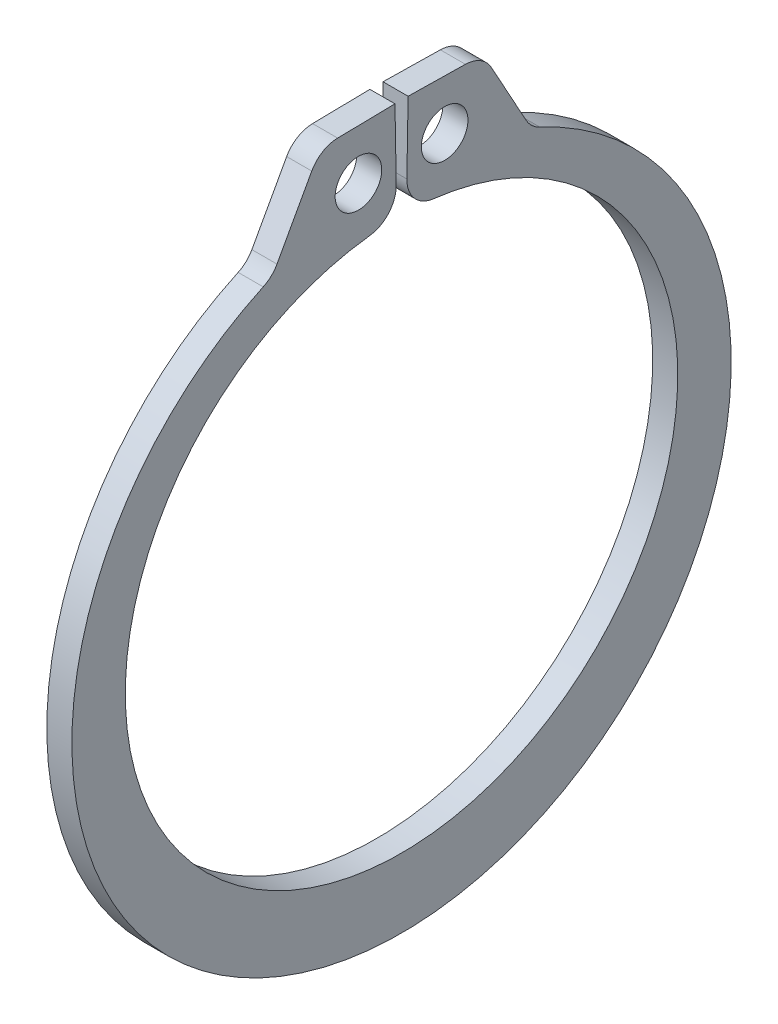
ISO-10303-21;
HEADER;
FILE_DESCRIPTION(('STEP AP214'),'2;1');
FILE_NAME('part.step','',(''),(''),'','','');
FILE_SCHEMA(('AUTOMOTIVE_DESIGN { 1 0 10303 214 1 1 1 1 }'));
ENDSEC;
DATA;
#1=APPLICATION_CONTEXT('core data for automotive mechanical design processes');
#2=APPLICATION_PROTOCOL_DEFINITION('international standard','automotive_design',2000,#1);
#3=PRODUCT_CONTEXT('',#1,'mechanical');
#4=PRODUCT('Part','Part','',(#3));
#5=PRODUCT_RELATED_PRODUCT_CATEGORY('part','',(#4));
#6=PRODUCT_DEFINITION_FORMATION('','',#4);
#7=PRODUCT_DEFINITION_CONTEXT('part definition',#1,'design');
#8=PRODUCT_DEFINITION('design','',#6,#7);
#9=PRODUCT_DEFINITION_SHAPE('','',#8);
#10=(LENGTH_UNIT() NAMED_UNIT(*) SI_UNIT(.MILLI.,.METRE.));
#11=(NAMED_UNIT(*) PLANE_ANGLE_UNIT() SI_UNIT($,.RADIAN.));
#12=(NAMED_UNIT(*) SI_UNIT($,.STERADIAN.) SOLID_ANGLE_UNIT());
#13=UNCERTAINTY_MEASURE_WITH_UNIT(LENGTH_MEASURE(1.E-05),#10,'distance_accuracy_value','');
#14=(GEOMETRIC_REPRESENTATION_CONTEXT(3) GLOBAL_UNCERTAINTY_ASSIGNED_CONTEXT((#13)) GLOBAL_UNIT_ASSIGNED_CONTEXT((#10,
#11,#12)) REPRESENTATION_CONTEXT('',''));
#15=CARTESIAN_POINT('',(0.,0.,0.));
#16=DIRECTION('',(0.,0.,1.));
#17=DIRECTION('',(1.,0.,0.));
#18=AXIS2_PLACEMENT_3D('',#15,#16,#17);
#19=CARTESIAN_POINT('',(0.5334,-0.676181068147733,0.));
#20=DIRECTION('',(1.,0.,0.));
#21=DIRECTION('',(0.,0.,-1.));
#22=AXIS2_PLACEMENT_3D('',#19,#20,#21);
#23=PLANE('',#22);
#24=CARTESIAN_POINT('',(0.5334,13.8385266688973,1.83246968592772));
#25=DIRECTION('',(1.,0.,0.));
#26=DIRECTION('',(0.,0.,-1.));
#27=AXIS2_PLACEMENT_3D('',#24,#25,#26);
#28=CIRCLE('',#27,0.9906);
#29=CARTESIAN_POINT('',(0.5334,13.8385266688973,0.841869685927717));
#30=VERTEX_POINT('',#29);
#31=EDGE_CURVE('E225',#30,#30,#28,.T.);
#32=ORIENTED_EDGE('',*,*,#31,.F.);
#33=EDGE_LOOP('',(#32));
#34=FACE_BOUND('',#33,.T.);
#35=DIRECTION('',(0.,0.876068599712976,0.482186487364531));
#36=VECTOR('',#35,1.);
#37=CARTESIAN_POINT('',(0.5334,15.9313425389448,-3.45991722723344));
#38=LINE('',#37,#36);
#39=CARTESIAN_POINT('',(0.5334,12.5932417303443,-5.29720154936887));
#40=VERTEX_POINT('',#39);
#41=CARTESIAN_POINT('',(0.5334,15.2803079489985,-3.81824542457083));
#42=VERTEX_POINT('',#41);
#43=EDGE_CURVE('E233',#40,#42,#38,.T.);
#44=ORIENTED_EDGE('',*,*,#43,.T.);
#45=CARTESIAN_POINT('',(0.5334,14.661807341656,-2.69451223171899));
#46=DIRECTION('',(1.,0.,0.));
#47=DIRECTION('',(0.,0.,-1.));
#48=AXIS2_PLACEMENT_3D('',#45,#46,#47);
#49=CIRCLE('',#48,1.2827);
#50=CARTESIAN_POINT('',(0.5334,15.9443119802331,-2.7168984334561));
#51=VERTEX_POINT('',#50);
#52=EDGE_CURVE('E291',#42,#51,#49,.T.);
#53=ORIENTED_EDGE('',*,*,#52,.T.);
#54=DIRECTION('',(0.,0.0174524064372829,0.999847695156391));
#55=VECTOR('',#54,1.);
#56=CARTESIAN_POINT('',(0.5334,15.9868647521641,-0.279051762247657));
#57=LINE('',#56,#55);
#58=CARTESIAN_POINT('',(0.5334,15.9868647521641,-0.279051762247657));
#59=VERTEX_POINT('',#58);
#60=EDGE_CURVE('E237',#51,#59,#57,.T.);
#61=ORIENTED_EDGE('',*,*,#60,.T.);
#62=DIRECTION('',(0.,-0.999847695156391,0.0174524064372838));
#63=VECTOR('',#62,1.);
#64=CARTESIAN_POINT('',(0.5334,11.7457107988497,-0.205022144621986));
#65=LINE('',#64,#63);
#66=CARTESIAN_POINT('',(0.5334,12.9649365342077,-0.226303808994815));
#67=VERTEX_POINT('',#66);
#68=EDGE_CURVE('E194',#59,#67,#65,.T.);
#69=ORIENTED_EDGE('',*,*,#68,.T.);
#70=CARTESIAN_POINT('',(0.5334,12.9425503324706,-1.50880844757192));
#71=DIRECTION('',(1.,0.,0.));
#72=DIRECTION('',(0.,0.,-1.));
#73=AXIS2_PLACEMENT_3D('',#70,#71,#72);
#74=CIRCLE('',#73,1.2827);
#75=CARTESIAN_POINT('',(0.5334,11.6684786135822,-1.36028052047176));
#76=VERTEX_POINT('',#75);
#77=EDGE_CURVE('E288',#67,#76,#74,.T.);
#78=ORIENTED_EDGE('',*,*,#77,.T.);
#79=CARTESIAN_POINT('',(0.5334,0.,0.));
#80=DIRECTION('',(-1.,0.,0.));
#81=DIRECTION('',(0.,0.,-1.));
#82=AXIS2_PLACEMENT_3D('',#79,#80,#81);
#83=CIRCLE('',#82,11.7475);
#84=CARTESIAN_POINT('',(0.5334,11.6684786135822,1.36028052047176));
#85=VERTEX_POINT('',#84);
#86=EDGE_CURVE('E242',#76,#85,#83,.T.);
#87=ORIENTED_EDGE('',*,*,#86,.T.);
#88=CARTESIAN_POINT('',(0.5334,12.9425503324706,1.50880844757192));
#89=DIRECTION('',(1.,0.,0.));
#90=DIRECTION('',(0.,0.,-1.));
#91=AXIS2_PLACEMENT_3D('',#88,#89,#90);
#92=CIRCLE('',#91,1.2827);
#93=CARTESIAN_POINT('',(0.5334,12.9649365342077,0.226303808994816));
#94=VERTEX_POINT('',#93);
#95=EDGE_CURVE('E285',#85,#94,#92,.T.);
#96=ORIENTED_EDGE('',*,*,#95,.T.);
#97=DIRECTION('',(0.,0.999847695156391,0.0174524064372836));
#98=VECTOR('',#97,1.);
#99=CARTESIAN_POINT('',(0.5334,11.7457107988497,0.205022144621988));
#100=LINE('',#99,#98);
#101=CARTESIAN_POINT('',(0.5334,15.9868647521641,0.279051762247657));
#102=VERTEX_POINT('',#101);
#103=EDGE_CURVE('E246',#94,#102,#100,.T.);
#104=ORIENTED_EDGE('',*,*,#103,.T.);
#105=DIRECTION('',(0.,-0.0174524064372829,0.999847695156391));
#106=VECTOR('',#105,1.);
#107=CARTESIAN_POINT('',(0.5334,15.9868647521641,0.279051762247657));
#108=LINE('',#107,#106);
#109=CARTESIAN_POINT('',(0.5334,15.9443119802331,2.71689843345609));
#110=VERTEX_POINT('',#109);
#111=EDGE_CURVE('E249',#102,#110,#108,.T.);
#112=ORIENTED_EDGE('',*,*,#111,.T.);
#113=CARTESIAN_POINT('',(0.5334,14.661807341656,2.69451223171899));
#114=DIRECTION('',(1.,0.,0.));
#115=DIRECTION('',(0.,0.,-1.));
#116=AXIS2_PLACEMENT_3D('',#113,#114,#115);
#117=CIRCLE('',#116,1.2827);
#118=CARTESIAN_POINT('',(0.5334,15.2803079489985,3.81824542457083));
#119=VERTEX_POINT('',#118);
#120=EDGE_CURVE('E72',#110,#119,#117,.T.);
#121=ORIENTED_EDGE('',*,*,#120,.T.);
#122=DIRECTION('',(0.,-0.876068599712977,0.48218648736453));
#123=VECTOR('',#122,1.);
#124=CARTESIAN_POINT('',(0.5334,15.9313425389448,3.45991722723344));
#125=LINE('',#124,#123);
#126=CARTESIAN_POINT('',(0.5334,12.5932417303443,5.29720154936887));
#127=VERTEX_POINT('',#126);
#128=EDGE_CURVE('E252',#119,#127,#125,.T.);
#129=ORIENTED_EDGE('',*,*,#128,.T.);
#130=CARTESIAN_POINT('',(0.5334,13.2117423376868,6.4209347422207));
#131=DIRECTION('',(1.,0.,0.));
#132=DIRECTION('',(0.,0.,-1.));
#133=AXIS2_PLACEMENT_3D('',#130,#131,#132);
#134=CIRCLE('',#133,1.2827);
#135=CARTESIAN_POINT('',(0.5334,12.0474579195929,5.88264013535209));
#136=VERTEX_POINT('',#135);
#137=EDGE_CURVE('E11',#127,#136,#134,.F.);
#138=ORIENTED_EDGE('',*,*,#137,.T.);
#139=CARTESIAN_POINT('',(0.5334,-0.676181068147733,0.));
#140=DIRECTION('',(1.,0.,0.));
#141=DIRECTION('',(0.,0.,-1.));
#142=AXIS2_PLACEMENT_3D('',#139,#140,#141);
#143=CIRCLE('',#142,14.0177189318523);
#144=CARTESIAN_POINT('',(0.5334,12.0474579195929,-5.88264013535209));
#145=VERTEX_POINT('',#144);
#146=EDGE_CURVE('E229',#136,#145,#143,.T.);
#147=ORIENTED_EDGE('',*,*,#146,.T.);
#148=CARTESIAN_POINT('',(0.5334,13.2117423376868,-6.42093474222071));
#149=DIRECTION('',(1.,0.,0.));
#150=DIRECTION('',(0.,0.,-1.));
#151=AXIS2_PLACEMENT_3D('',#148,#149,#150);
#152=CIRCLE('',#151,1.2827);
#153=EDGE_CURVE('E320',#145,#40,#152,.F.);
#154=ORIENTED_EDGE('',*,*,#153,.T.);
#155=EDGE_LOOP('',(#44,#53,#61,#69,#78,#87,#96,#104,#112,#121,#129,#138,#147,#154));
#156=FACE_BOUND('',#155,.T.);
#157=CARTESIAN_POINT('',(0.5334,13.8385266688973,-1.83246968592772));
#158=DIRECTION('',(1.,0.,0.));
#159=DIRECTION('',(0.,0.,-1.));
#160=AXIS2_PLACEMENT_3D('',#157,#158,#159);
#161=CIRCLE('',#160,0.990600000000001);
#162=CARTESIAN_POINT('',(0.5334,13.8385266688973,-2.82306968592772));
#163=VERTEX_POINT('',#162);
#164=EDGE_CURVE('E221',#163,#163,#161,.T.);
#165=ORIENTED_EDGE('',*,*,#164,.F.);
#166=EDGE_LOOP('',(#165));
#167=FACE_BOUND('',#166,.T.);
#168=ADVANCED_FACE('F43',(#34,#156,#167),#23,.T.);
#169=CARTESIAN_POINT('',(0.5334,-0.676181068147733,0.));
#170=DIRECTION('',(-1.,0.,0.));
#171=DIRECTION('',(0.,0.,1.));
#172=AXIS2_PLACEMENT_3D('',#169,#170,#171);
#173=CYLINDRICAL_SURFACE('',#172,14.0177189318523);
#174=CARTESIAN_POINT('',(-0.5334,-0.676181068147733,0.));
#175=DIRECTION('',(1.,0.,0.));
#176=DIRECTION('',(0.,0.,-1.));
#177=AXIS2_PLACEMENT_3D('',#174,#175,#176);
#178=CIRCLE('',#177,14.0177189318523);
#179=CARTESIAN_POINT('',(-0.5334,12.0474579195929,5.88264013535209));
#180=VERTEX_POINT('',#179);
#181=CARTESIAN_POINT('',(-0.5334,12.0474579195929,-5.88264013535209));
#182=VERTEX_POINT('',#181);
#183=EDGE_CURVE('E326',#180,#182,#178,.T.);
#184=ORIENTED_EDGE('',*,*,#183,.T.);
#185=DIRECTION('',(-1.,0.,0.));
#186=VECTOR('',#185,1.);
#187=CARTESIAN_POINT('',(0.5334,12.0474579195929,-5.88264013535209));
#188=LINE('',#187,#186);
#189=EDGE_CURVE('E268',#182,#145,#188,.F.);
#190=ORIENTED_EDGE('',*,*,#189,.T.);
#191=ORIENTED_EDGE('',*,*,#146,.F.);
#192=DIRECTION('',(-1.,0.,0.));
#193=VECTOR('',#192,1.);
#194=CARTESIAN_POINT('',(0.5334,12.0474579195929,5.88264013535209));
#195=LINE('',#194,#193);
#196=EDGE_CURVE('E264',#136,#180,#195,.T.);
#197=ORIENTED_EDGE('',*,*,#196,.T.);
#198=EDGE_LOOP('',(#184,#190,#191,#197));
#199=FACE_BOUND('',#198,.T.);
#200=ADVANCED_FACE('F336',(#199),#173,.T.);
#201=CARTESIAN_POINT('',(0.5334,15.9313425389448,-3.45991722723344));
#202=DIRECTION('',(0.,-0.482186487364531,0.876068599712976));
#203=DIRECTION('',(0.,-0.876068599712976,-0.482186487364531));
#204=AXIS2_PLACEMENT_3D('',#201,#202,#203);
#205=PLANE('',#204);
#206=ORIENTED_EDGE('',*,*,#43,.F.);
#207=DIRECTION('',(1.,0.,0.));
#208=VECTOR('',#207,1.);
#209=CARTESIAN_POINT('',(-0.5334,12.5932417303443,-5.29720154936887));
#210=LINE('',#209,#208);
#211=CARTESIAN_POINT('',(-0.5334,12.5932417303443,-5.29720154936887));
#212=VERTEX_POINT('',#211);
#213=EDGE_CURVE('E260',#40,#212,#210,.F.);
#214=ORIENTED_EDGE('',*,*,#213,.T.);
#215=DIRECTION('',(0.,0.876068599712976,0.482186487364531));
#216=VECTOR('',#215,1.);
#217=CARTESIAN_POINT('',(-0.5334,15.9313425389448,-3.45991722723344));
#218=LINE('',#217,#216);
#219=CARTESIAN_POINT('',(-0.5334,15.2803079489985,-3.81824542457083));
#220=VERTEX_POINT('',#219);
#221=EDGE_CURVE('E187',#212,#220,#218,.T.);
#222=ORIENTED_EDGE('',*,*,#221,.T.);
#223=DIRECTION('',(-1.,0.,0.));
#224=VECTOR('',#223,1.);
#225=CARTESIAN_POINT('',(0.5334,15.2803079489985,-3.81824542457083));
#226=LINE('',#225,#224);
#227=EDGE_CURVE('E196',#220,#42,#226,.F.);
#228=ORIENTED_EDGE('',*,*,#227,.T.);
#229=EDGE_LOOP('',(#206,#214,#222,#228));
#230=FACE_BOUND('',#229,.T.);
#231=ADVANCED_FACE('F344',(#230),#205,.F.);
#232=CARTESIAN_POINT('',(0.5334,15.9868647521641,-0.279051762247657));
#233=DIRECTION('',(0.,-0.999847695156391,0.0174524064372829));
#234=DIRECTION('',(0.,-0.0174524064372829,-0.999847695156391));
#235=AXIS2_PLACEMENT_3D('',#232,#233,#234);
#236=PLANE('',#235);
#237=ORIENTED_EDGE('',*,*,#60,.F.);
#238=DIRECTION('',(-1.,0.,0.));
#239=VECTOR('',#238,1.);
#240=CARTESIAN_POINT('',(0.5334,15.9443119802331,-2.7168984334561));
#241=LINE('',#240,#239);
#242=CARTESIAN_POINT('',(-0.5334,15.9443119802331,-2.7168984334561));
#243=VERTEX_POINT('',#242);
#244=EDGE_CURVE('E182',#51,#243,#241,.T.);
#245=ORIENTED_EDGE('',*,*,#244,.T.);
#246=DIRECTION('',(0.,0.0174524064372829,0.999847695156391));
#247=VECTOR('',#246,1.);
#248=CARTESIAN_POINT('',(-0.5334,15.9868647521641,-0.279051762247657));
#249=LINE('',#248,#247);
#250=CARTESIAN_POINT('',(-0.5334,15.9868647521641,-0.279051762247657));
#251=VERTEX_POINT('',#250);
#252=EDGE_CURVE('E175',#243,#251,#249,.T.);
#253=ORIENTED_EDGE('',*,*,#252,.T.);
#254=DIRECTION('',(-1.,0.,0.));
#255=VECTOR('',#254,1.);
#256=CARTESIAN_POINT('',(0.5334,15.9868647521641,-0.279051762247657));
#257=LINE('',#256,#255);
#258=EDGE_CURVE('E179',#59,#251,#257,.T.);
#259=ORIENTED_EDGE('',*,*,#258,.F.);
#260=EDGE_LOOP('',(#237,#245,#253,#259));
#261=FACE_BOUND('',#260,.T.);
#262=ADVANCED_FACE('F178',(#261),#236,.F.);
#263=CARTESIAN_POINT('',(0.5334,11.7457107988497,-0.205022144621986));
#264=DIRECTION('',(0.,-0.0174524064372838,-0.999847695156391));
#265=DIRECTION('',(0.,0.999847695156391,-0.0174524064372838));
#266=AXIS2_PLACEMENT_3D('',#263,#264,#265);
#267=PLANE('',#266);
#268=DIRECTION('',(0.,-0.999847695156391,0.0174524064372838));
#269=VECTOR('',#268,1.);
#270=CARTESIAN_POINT('',(-0.5334,11.7457107988497,-0.205022144621986));
#271=LINE('',#270,#269);
#272=CARTESIAN_POINT('',(-0.5334,12.9649365342077,-0.226303808994815));
#273=VERTEX_POINT('',#272);
#274=EDGE_CURVE('E186',#251,#273,#271,.T.);
#275=ORIENTED_EDGE('',*,*,#274,.T.);
#276=DIRECTION('',(-1.,0.,0.));
#277=VECTOR('',#276,1.);
#278=CARTESIAN_POINT('',(0.5334,12.9649365342077,-0.226303808994815));
#279=LINE('',#278,#277);
#280=EDGE_CURVE('E301',#273,#67,#279,.F.);
#281=ORIENTED_EDGE('',*,*,#280,.T.);
#282=ORIENTED_EDGE('',*,*,#68,.F.);
#283=ORIENTED_EDGE('',*,*,#258,.T.);
#284=EDGE_LOOP('',(#275,#281,#282,#283));
#285=FACE_BOUND('',#284,.T.);
#286=ADVANCED_FACE('F191',(#285),#267,.F.);
#287=CARTESIAN_POINT('',(0.5334,0.,0.));
#288=DIRECTION('',(-1.,0.,0.));
#289=DIRECTION('',(0.,0.,1.));
#290=AXIS2_PLACEMENT_3D('',#287,#288,#289);
#291=CYLINDRICAL_SURFACE('',#290,11.7475);
#292=ORIENTED_EDGE('',*,*,#86,.F.);
#293=DIRECTION('',(-1.,0.,0.));
#294=VECTOR('',#293,1.);
#295=CARTESIAN_POINT('',(0.5334,11.6684786135822,-1.36028052047176));
#296=LINE('',#295,#294);
#297=CARTESIAN_POINT('',(-0.5334,11.6684786135822,-1.36028052047176));
#298=VERTEX_POINT('',#297);
#299=EDGE_CURVE('E297',#76,#298,#296,.T.);
#300=ORIENTED_EDGE('',*,*,#299,.T.);
#301=CARTESIAN_POINT('',(-0.5334,0.,0.));
#302=DIRECTION('',(-1.,0.,0.));
#303=DIRECTION('',(0.,0.,-1.));
#304=AXIS2_PLACEMENT_3D('',#301,#302,#303);
#305=CIRCLE('',#304,11.7475);
#306=CARTESIAN_POINT('',(-0.5334,11.6684786135822,1.36028052047176));
#307=VERTEX_POINT('',#306);
#308=EDGE_CURVE('E203',#298,#307,#305,.T.);
#309=ORIENTED_EDGE('',*,*,#308,.T.);
#310=DIRECTION('',(-1.,0.,0.));
#311=VECTOR('',#310,1.);
#312=CARTESIAN_POINT('',(0.5334,11.6684786135822,1.36028052047176));
#313=LINE('',#312,#311);
#314=EDGE_CURVE('E294',#307,#85,#313,.F.);
#315=ORIENTED_EDGE('',*,*,#314,.T.);
#316=EDGE_LOOP('',(#292,#300,#309,#315));
#317=FACE_BOUND('',#316,.T.);
#318=ADVANCED_FACE('F356',(#317),#291,.F.);
#319=CARTESIAN_POINT('',(0.5334,11.7457107988497,0.205022144621988));
#320=DIRECTION('',(0.,-0.0174524064372836,0.999847695156391));
#321=DIRECTION('',(0.,-0.999847695156391,-0.0174524064372836));
#322=AXIS2_PLACEMENT_3D('',#319,#320,#321);
#323=PLANE('',#322);
#324=ORIENTED_EDGE('',*,*,#103,.F.);
#325=DIRECTION('',(-1.,0.,0.));
#326=VECTOR('',#325,1.);
#327=CARTESIAN_POINT('',(0.5334,12.9649365342077,0.226303808994816));
#328=LINE('',#327,#326);
#329=CARTESIAN_POINT('',(-0.5334,12.9649365342077,0.226303808994816));
#330=VERTEX_POINT('',#329);
#331=EDGE_CURVE('E304',#94,#330,#328,.T.);
#332=ORIENTED_EDGE('',*,*,#331,.T.);
#333=DIRECTION('',(0.,0.999847695156391,0.0174524064372836));
#334=VECTOR('',#333,1.);
#335=CARTESIAN_POINT('',(-0.5334,11.7457107988497,0.205022144621988));
#336=LINE('',#335,#334);
#337=CARTESIAN_POINT('',(-0.5334,15.9868647521641,0.279051762247657));
#338=VERTEX_POINT('',#337);
#339=EDGE_CURVE('E208',#330,#338,#336,.T.);
#340=ORIENTED_EDGE('',*,*,#339,.T.);
#341=DIRECTION('',(-1.,0.,0.));
#342=VECTOR('',#341,1.);
#343=CARTESIAN_POINT('',(0.5334,15.9868647521641,0.279051762247657));
#344=LINE('',#343,#342);
#345=EDGE_CURVE('E197',#102,#338,#344,.T.);
#346=ORIENTED_EDGE('',*,*,#345,.F.);
#347=EDGE_LOOP('',(#324,#332,#340,#346));
#348=FACE_BOUND('',#347,.T.);
#349=ADVANCED_FACE('F366',(#348),#323,.F.);
#350=CARTESIAN_POINT('',(0.5334,15.9868647521641,0.279051762247657));
#351=DIRECTION('',(0.,-0.999847695156391,-0.0174524064372829));
#352=DIRECTION('',(0.,0.0174524064372829,-0.999847695156391));
#353=AXIS2_PLACEMENT_3D('',#350,#351,#352);
#354=PLANE('',#353);
#355=DIRECTION('',(0.,-0.0174524064372829,0.999847695156391));
#356=VECTOR('',#355,1.);
#357=CARTESIAN_POINT('',(-0.5334,15.9868647521641,0.279051762247657));
#358=LINE('',#357,#356);
#359=CARTESIAN_POINT('',(-0.5334,15.9443119802331,2.71689843345609));
#360=VERTEX_POINT('',#359);
#361=EDGE_CURVE('E214',#338,#360,#358,.T.);
#362=ORIENTED_EDGE('',*,*,#361,.T.);
#363=DIRECTION('',(-1.,0.,0.));
#364=VECTOR('',#363,1.);
#365=CARTESIAN_POINT('',(0.5334,15.9443119802331,2.71689843345609));
#366=LINE('',#365,#364);
#367=EDGE_CURVE('E314',#360,#110,#366,.F.);
#368=ORIENTED_EDGE('',*,*,#367,.T.);
#369=ORIENTED_EDGE('',*,*,#111,.F.);
#370=ORIENTED_EDGE('',*,*,#345,.T.);
#371=EDGE_LOOP('',(#362,#368,#369,#370));
#372=FACE_BOUND('',#371,.T.);
#373=ADVANCED_FACE('F373',(#372),#354,.F.);
#374=CARTESIAN_POINT('',(0.5334,15.9313425389448,3.45991722723344));
#375=DIRECTION('',(0.,-0.48218648736453,-0.876068599712977));
#376=DIRECTION('',(0.,0.876068599712977,-0.48218648736453));
#377=AXIS2_PLACEMENT_3D('',#374,#375,#376);
#378=PLANE('',#377);
#379=ORIENTED_EDGE('',*,*,#128,.F.);
#380=DIRECTION('',(-1.,0.,0.));
#381=VECTOR('',#380,1.);
#382=CARTESIAN_POINT('',(0.5334,15.2803079489985,3.81824542457083));
#383=LINE('',#382,#381);
#384=CARTESIAN_POINT('',(-0.5334,15.2803079489985,3.81824542457083));
#385=VERTEX_POINT('',#384);
#386=EDGE_CURVE('E310',#119,#385,#383,.T.);
#387=ORIENTED_EDGE('',*,*,#386,.T.);
#388=DIRECTION('',(0.,-0.876068599712977,0.48218648736453));
#389=VECTOR('',#388,1.);
#390=CARTESIAN_POINT('',(-0.5334,15.9313425389448,3.45991722723344));
#391=LINE('',#390,#389);
#392=CARTESIAN_POINT('',(-0.5334,12.5932417303443,5.29720154936887));
#393=VERTEX_POINT('',#392);
#394=EDGE_CURVE('E218',#385,#393,#391,.T.);
#395=ORIENTED_EDGE('',*,*,#394,.T.);
#396=DIRECTION('',(1.,0.,0.));
#397=VECTOR('',#396,1.);
#398=CARTESIAN_POINT('',(0.5334,12.5932417303443,5.29720154936886));
#399=LINE('',#398,#397);
#400=EDGE_CURVE('E62',#393,#127,#399,.T.);
#401=ORIENTED_EDGE('',*,*,#400,.T.);
#402=EDGE_LOOP('',(#379,#387,#395,#401));
#403=FACE_BOUND('',#402,.T.);
#404=ADVANCED_FACE('F329',(#403),#378,.F.);
#405=CARTESIAN_POINT('',(0.5334,13.8385266688973,1.83246968592772));
#406=DIRECTION('',(-1.,0.,0.));
#407=DIRECTION('',(0.,0.,1.));
#408=AXIS2_PLACEMENT_3D('',#405,#406,#407);
#409=CYLINDRICAL_SURFACE('',#408,0.9906);
#410=ORIENTED_EDGE('',*,*,#31,.T.);
#411=EDGE_LOOP('',(#410));
#412=FACE_BOUND('',#411,.T.);
#413=CARTESIAN_POINT('',(-0.5334,13.8385266688973,1.83246968592772));
#414=DIRECTION('',(1.,0.,0.));
#415=DIRECTION('',(0.,0.,-1.));
#416=AXIS2_PLACEMENT_3D('',#413,#414,#415);
#417=CIRCLE('',#416,0.9906);
#418=CARTESIAN_POINT('',(-0.5334,13.8385266688973,0.841869685927717));
#419=VERTEX_POINT('',#418);
#420=EDGE_CURVE('E410',#419,#419,#417,.T.);
#421=ORIENTED_EDGE('',*,*,#420,.F.);
#422=EDGE_LOOP('',(#421));
#423=FACE_BOUND('',#422,.T.);
#424=ADVANCED_FACE('F381',(#412,#423),#409,.F.);
#425=CARTESIAN_POINT('',(0.5334,13.8385266688973,-1.83246968592772));
#426=DIRECTION('',(-1.,0.,0.));
#427=DIRECTION('',(0.,0.,1.));
#428=AXIS2_PLACEMENT_3D('',#425,#426,#427);
#429=CYLINDRICAL_SURFACE('',#428,0.990600000000001);
#430=ORIENTED_EDGE('',*,*,#164,.T.);
#431=EDGE_LOOP('',(#430));
#432=FACE_BOUND('',#431,.T.);
#433=CARTESIAN_POINT('',(-0.5334,13.8385266688973,-1.83246968592772));
#434=DIRECTION('',(1.,0.,0.));
#435=DIRECTION('',(0.,0.,-1.));
#436=AXIS2_PLACEMENT_3D('',#433,#434,#435);
#437=CIRCLE('',#436,0.990600000000001);
#438=CARTESIAN_POINT('',(-0.5334,13.8385266688973,-2.82306968592772));
#439=VERTEX_POINT('',#438);
#440=EDGE_CURVE('E407',#439,#439,#437,.T.);
#441=ORIENTED_EDGE('',*,*,#440,.F.);
#442=EDGE_LOOP('',(#441));
#443=FACE_BOUND('',#442,.T.);
#444=ADVANCED_FACE('F395',(#432,#443),#429,.F.);
#445=CARTESIAN_POINT('',(-0.5334,-0.676181068147733,0.));
#446=DIRECTION('',(1.,0.,0.));
#447=DIRECTION('',(0.,0.,-1.));
#448=AXIS2_PLACEMENT_3D('',#445,#446,#447);
#449=PLANE('',#448);
#450=ORIENTED_EDGE('',*,*,#440,.T.);
#451=EDGE_LOOP('',(#450));
#452=FACE_BOUND('',#451,.T.);
#453=ORIENTED_EDGE('',*,*,#420,.T.);
#454=EDGE_LOOP('',(#453));
#455=FACE_BOUND('',#454,.T.);
#456=ORIENTED_EDGE('',*,*,#252,.F.);
#457=CARTESIAN_POINT('',(-0.5334,14.661807341656,-2.69451223171899));
#458=DIRECTION('',(1.,0.,0.));
#459=DIRECTION('',(0.,0.,-1.));
#460=AXIS2_PLACEMENT_3D('',#457,#458,#459);
#461=CIRCLE('',#460,1.2827);
#462=EDGE_CURVE('E280',#243,#220,#461,.F.);
#463=ORIENTED_EDGE('',*,*,#462,.T.);
#464=ORIENTED_EDGE('',*,*,#221,.F.);
#465=CARTESIAN_POINT('',(-0.5334,13.2117423376868,-6.42093474222071));
#466=DIRECTION('',(1.,0.,0.));
#467=DIRECTION('',(0.,0.,-1.));
#468=AXIS2_PLACEMENT_3D('',#465,#466,#467);
#469=CIRCLE('',#468,1.2827);
#470=EDGE_CURVE('E317',#212,#182,#469,.T.);
#471=ORIENTED_EDGE('',*,*,#470,.T.);
#472=ORIENTED_EDGE('',*,*,#183,.F.);
#473=CARTESIAN_POINT('',(-0.5334,13.2117423376868,6.4209347422207));
#474=DIRECTION('',(1.,0.,0.));
#475=DIRECTION('',(0.,0.,-1.));
#476=AXIS2_PLACEMENT_3D('',#473,#474,#475);
#477=CIRCLE('',#476,1.2827);
#478=EDGE_CURVE('E52',#180,#393,#477,.T.);
#479=ORIENTED_EDGE('',*,*,#478,.T.);
#480=ORIENTED_EDGE('',*,*,#394,.F.);
#481=CARTESIAN_POINT('',(-0.5334,14.661807341656,2.69451223171899));
#482=DIRECTION('',(1.,0.,0.));
#483=DIRECTION('',(0.,0.,-1.));
#484=AXIS2_PLACEMENT_3D('',#481,#482,#483);
#485=CIRCLE('',#484,1.2827);
#486=EDGE_CURVE('E273',#385,#360,#485,.F.);
#487=ORIENTED_EDGE('',*,*,#486,.T.);
#488=ORIENTED_EDGE('',*,*,#361,.F.);
#489=ORIENTED_EDGE('',*,*,#339,.F.);
#490=CARTESIAN_POINT('',(-0.5334,12.9425503324706,1.50880844757192));
#491=DIRECTION('',(1.,0.,0.));
#492=DIRECTION('',(0.,0.,-1.));
#493=AXIS2_PLACEMENT_3D('',#490,#491,#492);
#494=CIRCLE('',#493,1.2827);
#495=EDGE_CURVE('E276',#330,#307,#494,.F.);
#496=ORIENTED_EDGE('',*,*,#495,.T.);
#497=ORIENTED_EDGE('',*,*,#308,.F.);
#498=CARTESIAN_POINT('',(-0.5334,12.9425503324706,-1.50880844757192));
#499=DIRECTION('',(1.,0.,0.));
#500=DIRECTION('',(0.,0.,-1.));
#501=AXIS2_PLACEMENT_3D('',#498,#499,#500);
#502=CIRCLE('',#501,1.2827);
#503=EDGE_CURVE('E201',#298,#273,#502,.F.);
#504=ORIENTED_EDGE('',*,*,#503,.T.);
#505=ORIENTED_EDGE('',*,*,#274,.F.);
#506=EDGE_LOOP('',(#456,#463,#464,#471,#472,#479,#480,#487,#488,#489,#496,#497,#504,#505));
#507=FACE_BOUND('',#506,.T.);
#508=ADVANCED_FACE('F199',(#452,#455,#507),#449,.F.);
#509=CARTESIAN_POINT('',(0.5334,13.2117423376868,-6.42093474222071));
#510=DIRECTION('',(-1.,0.,0.));
#511=DIRECTION('',(0.,0.,1.));
#512=AXIS2_PLACEMENT_3D('',#509,#510,#511);
#513=CYLINDRICAL_SURFACE('',#512,1.2827);
#514=ORIENTED_EDGE('',*,*,#153,.F.);
#515=ORIENTED_EDGE('',*,*,#189,.F.);
#516=ORIENTED_EDGE('',*,*,#470,.F.);
#517=ORIENTED_EDGE('',*,*,#213,.F.);
#518=EDGE_LOOP('',(#514,#515,#516,#517));
#519=FACE_BOUND('',#518,.T.);
#520=ADVANCED_FACE('F339',(#519),#513,.F.);
#521=CARTESIAN_POINT('',(0.5334,14.661807341656,-2.69451223171899));
#522=DIRECTION('',(-1.,0.,0.));
#523=DIRECTION('',(0.,0.,1.));
#524=AXIS2_PLACEMENT_3D('',#521,#522,#523);
#525=CYLINDRICAL_SURFACE('',#524,1.2827);
#526=ORIENTED_EDGE('',*,*,#52,.F.);
#527=ORIENTED_EDGE('',*,*,#227,.F.);
#528=ORIENTED_EDGE('',*,*,#462,.F.);
#529=ORIENTED_EDGE('',*,*,#244,.F.);
#530=EDGE_LOOP('',(#526,#527,#528,#529));
#531=FACE_BOUND('',#530,.T.);
#532=ADVANCED_FACE('F349',(#531),#525,.T.);
#533=CARTESIAN_POINT('',(0.5334,12.9425503324706,-1.50880844757192));
#534=DIRECTION('',(-1.,0.,0.));
#535=DIRECTION('',(0.,0.,1.));
#536=AXIS2_PLACEMENT_3D('',#533,#534,#535);
#537=CYLINDRICAL_SURFACE('',#536,1.2827);
#538=ORIENTED_EDGE('',*,*,#77,.F.);
#539=ORIENTED_EDGE('',*,*,#280,.F.);
#540=ORIENTED_EDGE('',*,*,#503,.F.);
#541=ORIENTED_EDGE('',*,*,#299,.F.);
#542=EDGE_LOOP('',(#538,#539,#540,#541));
#543=FACE_BOUND('',#542,.T.);
#544=ADVANCED_FACE('F354',(#543),#537,.T.);
#545=CARTESIAN_POINT('',(0.5334,12.9425503324706,1.50880844757192));
#546=DIRECTION('',(-1.,0.,0.));
#547=DIRECTION('',(0.,0.,1.));
#548=AXIS2_PLACEMENT_3D('',#545,#546,#547);
#549=CYLINDRICAL_SURFACE('',#548,1.2827);
#550=ORIENTED_EDGE('',*,*,#95,.F.);
#551=ORIENTED_EDGE('',*,*,#314,.F.);
#552=ORIENTED_EDGE('',*,*,#495,.F.);
#553=ORIENTED_EDGE('',*,*,#331,.F.);
#554=EDGE_LOOP('',(#550,#551,#552,#553));
#555=FACE_BOUND('',#554,.T.);
#556=ADVANCED_FACE('F363',(#555),#549,.T.);
#557=CARTESIAN_POINT('',(0.5334,14.661807341656,2.69451223171899));
#558=DIRECTION('',(-1.,0.,0.));
#559=DIRECTION('',(0.,0.,1.));
#560=AXIS2_PLACEMENT_3D('',#557,#558,#559);
#561=CYLINDRICAL_SURFACE('',#560,1.2827);
#562=ORIENTED_EDGE('',*,*,#120,.F.);
#563=ORIENTED_EDGE('',*,*,#367,.F.);
#564=ORIENTED_EDGE('',*,*,#486,.F.);
#565=ORIENTED_EDGE('',*,*,#386,.F.);
#566=EDGE_LOOP('',(#562,#563,#564,#565));
#567=FACE_BOUND('',#566,.T.);
#568=ADVANCED_FACE('F372',(#567),#561,.T.);
#569=CARTESIAN_POINT('',(0.5334,13.2117423376868,6.4209347422207));
#570=DIRECTION('',(-1.,0.,0.));
#571=DIRECTION('',(0.,0.,1.));
#572=AXIS2_PLACEMENT_3D('',#569,#570,#571);
#573=CYLINDRICAL_SURFACE('',#572,1.2827);
#574=ORIENTED_EDGE('',*,*,#137,.F.);
#575=ORIENTED_EDGE('',*,*,#400,.F.);
#576=ORIENTED_EDGE('',*,*,#478,.F.);
#577=ORIENTED_EDGE('',*,*,#196,.F.);
#578=EDGE_LOOP('',(#574,#575,#576,#577));
#579=FACE_BOUND('',#578,.T.);
#580=ADVANCED_FACE('F45',(#579),#573,.F.);
#581=CLOSED_SHELL('',(#168,#200,#231,#262,#286,#318,#349,#373,#404,#424,#444,#508,#520,#532,
#544,#556,#568,#580));
#582=MANIFOLD_SOLID_BREP('B2',#581);
#583=ADVANCED_BREP_SHAPE_REPRESENTATION('',(#18,#582),#14);
#584=SHAPE_DEFINITION_REPRESENTATION(#9,#583);
ENDSEC;
END-ISO-10303-21;
